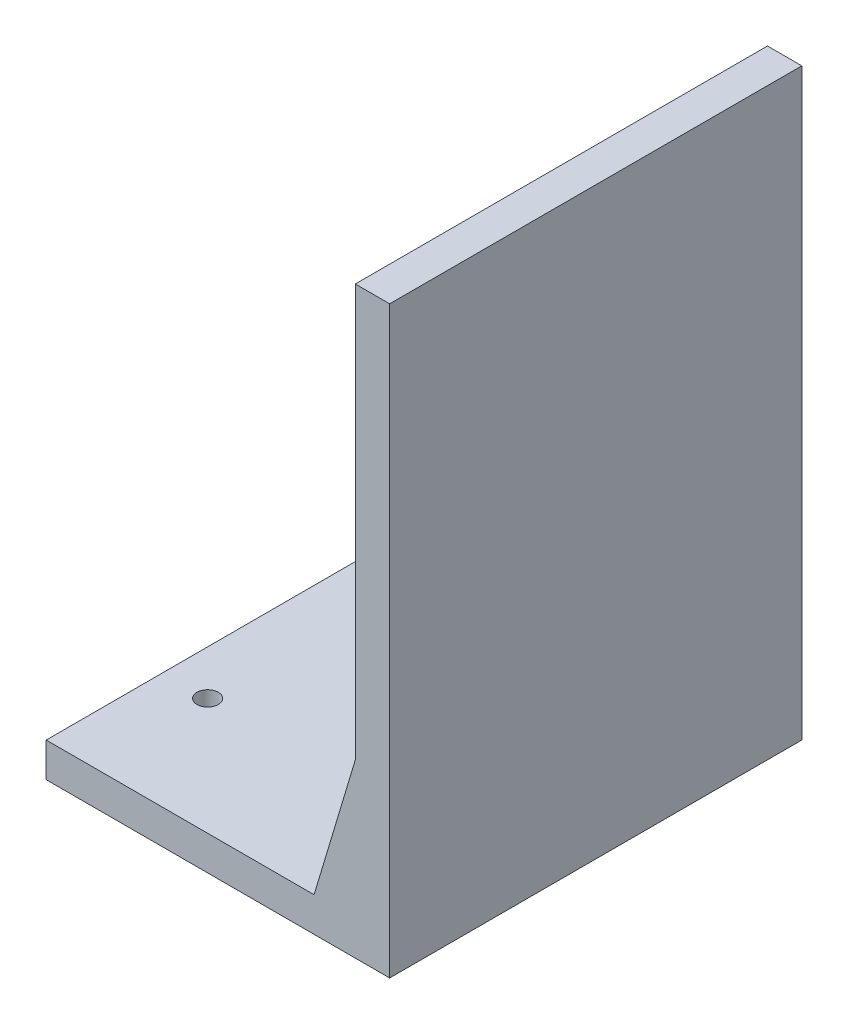
ISO-10303-21;
HEADER;
FILE_DESCRIPTION(('STEP AP214'),'2;1');
FILE_NAME('part.step','',(''),(''),'','','');
FILE_SCHEMA(('AUTOMOTIVE_DESIGN { 1 0 10303 214 1 1 1 1 }'));
ENDSEC;
DATA;
#1=APPLICATION_CONTEXT('core data for automotive mechanical design processes');
#2=APPLICATION_PROTOCOL_DEFINITION('international standard','automotive_design',2000,#1);
#3=PRODUCT_CONTEXT('',#1,'mechanical');
#4=PRODUCT('Part','Part','',(#3));
#5=PRODUCT_RELATED_PRODUCT_CATEGORY('part','',(#4));
#6=PRODUCT_DEFINITION_FORMATION('','',#4);
#7=PRODUCT_DEFINITION_CONTEXT('part definition',#1,'design');
#8=PRODUCT_DEFINITION('design','',#6,#7);
#9=PRODUCT_DEFINITION_SHAPE('','',#8);
#10=(LENGTH_UNIT() NAMED_UNIT(*) SI_UNIT(.MILLI.,.METRE.));
#11=(NAMED_UNIT(*) PLANE_ANGLE_UNIT() SI_UNIT($,.RADIAN.));
#12=(NAMED_UNIT(*) SI_UNIT($,.STERADIAN.) SOLID_ANGLE_UNIT());
#13=UNCERTAINTY_MEASURE_WITH_UNIT(LENGTH_MEASURE(1.E-05),#10,'distance_accuracy_value','');
#14=(GEOMETRIC_REPRESENTATION_CONTEXT(3) GLOBAL_UNCERTAINTY_ASSIGNED_CONTEXT((#13)) GLOBAL_UNIT_ASSIGNED_CONTEXT((#10,
#11,#12)) REPRESENTATION_CONTEXT('',''));
#15=CARTESIAN_POINT('',(0.,0.,0.));
#16=DIRECTION('',(0.,0.,1.));
#17=DIRECTION('',(1.,0.,0.));
#18=AXIS2_PLACEMENT_3D('',#15,#16,#17);
#19=CARTESIAN_POINT('',(0.,5.,0.));
#20=DIRECTION('',(0.,-1.,0.));
#21=DIRECTION('',(0.,0.,-1.));
#22=AXIS2_PLACEMENT_3D('',#19,#20,#21);
#23=PLANE('',#22);
#24=CARTESIAN_POINT('',(32.5,5.,-43.));
#25=DIRECTION('',(0.,1.,0.));
#26=DIRECTION('',(0.,0.,-1.));
#27=AXIS2_PLACEMENT_3D('',#24,#25,#26);
#28=CIRCLE('',#27,1.55);
#29=CARTESIAN_POINT('',(32.5,5.,-44.55));
#30=VERTEX_POINT('',#29);
#31=EDGE_CURVE('E330',#30,#30,#28,.T.);
#32=ORIENTED_EDGE('',*,*,#31,.F.);
#33=EDGE_LOOP('',(#32));
#34=FACE_BOUND('',#33,.T.);
#35=CARTESIAN_POINT('',(6.5,5.,-17.));
#36=DIRECTION('',(0.,1.,0.));
#37=DIRECTION('',(0.,0.,-1.));
#38=AXIS2_PLACEMENT_3D('',#35,#36,#37);
#39=CIRCLE('',#38,1.55);
#40=CARTESIAN_POINT('',(6.5,5.,-18.55));
#41=VERTEX_POINT('',#40);
#42=EDGE_CURVE('E321',#41,#41,#39,.T.);
#43=ORIENTED_EDGE('',*,*,#42,.F.);
#44=EDGE_LOOP('',(#43));
#45=FACE_BOUND('',#44,.T.);
#46=CARTESIAN_POINT('',(32.5,5.,-17.));
#47=DIRECTION('',(0.,1.,0.));
#48=DIRECTION('',(0.,0.,1.));
#49=AXIS2_PLACEMENT_3D('',#46,#47,#48);
#50=CIRCLE('',#49,1.55);
#51=CARTESIAN_POINT('',(32.5,5.,-15.45));
#52=VERTEX_POINT('',#51);
#53=EDGE_CURVE('E337',#52,#52,#50,.T.);
#54=ORIENTED_EDGE('',*,*,#53,.F.);
#55=EDGE_LOOP('',(#54));
#56=FACE_BOUND('',#55,.T.);
#57=CARTESIAN_POINT('',(6.5,5.,-43.));
#58=DIRECTION('',(0.,1.,0.));
#59=DIRECTION('',(0.,0.,1.));
#60=AXIS2_PLACEMENT_3D('',#57,#58,#59);
#61=CIRCLE('',#60,1.55);
#62=CARTESIAN_POINT('',(6.5,5.,-41.45));
#63=VERTEX_POINT('',#62);
#64=EDGE_CURVE('E313',#63,#63,#61,.T.);
#65=ORIENTED_EDGE('',*,*,#64,.F.);
#66=EDGE_LOOP('',(#65));
#67=FACE_BOUND('',#66,.T.);
#68=DIRECTION('',(-1.,0.,0.));
#69=VECTOR('',#68,1.);
#70=CARTESIAN_POINT('',(45.,5.,-35.));
#71=LINE('',#70,#69);
#72=CARTESIAN_POINT('',(45.,5.,-35.));
#73=VERTEX_POINT('',#72);
#74=CARTESIAN_POINT('',(39.,5.,-35.));
#75=VERTEX_POINT('',#74);
#76=EDGE_CURVE('E148',#73,#75,#71,.T.);
#77=ORIENTED_EDGE('',*,*,#76,.F.);
#78=DIRECTION('',(0.,0.,1.));
#79=VECTOR('',#78,1.);
#80=CARTESIAN_POINT('',(45.,5.,0.));
#81=LINE('',#80,#79);
#82=CARTESIAN_POINT('',(45.,5.,-50.));
#83=VERTEX_POINT('',#82);
#84=EDGE_CURVE('E212',#83,#73,#81,.T.);
#85=ORIENTED_EDGE('',*,*,#84,.F.);
#86=DIRECTION('',(-1.,0.,0.));
#87=VECTOR('',#86,1.);
#88=CARTESIAN_POINT('',(45.,5.,-50.));
#89=LINE('',#88,#87);
#90=CARTESIAN_POINT('',(39.,5.,-50.));
#91=VERTEX_POINT('',#90);
#92=EDGE_CURVE('E63',#83,#91,#89,.T.);
#93=ORIENTED_EDGE('',*,*,#92,.T.);
#94=DIRECTION('',(0.,0.,-1.));
#95=VECTOR('',#94,1.);
#96=CARTESIAN_POINT('',(39.,5.,-50.));
#97=LINE('',#96,#95);
#98=CARTESIAN_POINT('',(39.,5.,-60.));
#99=VERTEX_POINT('',#98);
#100=EDGE_CURVE('E175',#91,#99,#97,.T.);
#101=ORIENTED_EDGE('',*,*,#100,.T.);
#102=DIRECTION('',(-1.,0.,0.));
#103=VECTOR('',#102,1.);
#104=CARTESIAN_POINT('',(0.,5.,-60.));
#105=LINE('',#104,#103);
#106=CARTESIAN_POINT('',(0.,5.,-60.));
#107=VERTEX_POINT('',#106);
#108=EDGE_CURVE('E241',#99,#107,#105,.T.);
#109=ORIENTED_EDGE('',*,*,#108,.T.);
#110=DIRECTION('',(0.,0.,1.));
#111=VECTOR('',#110,1.);
#112=CARTESIAN_POINT('',(0.,5.,0.));
#113=LINE('',#112,#111);
#114=CARTESIAN_POINT('',(0.,5.,0.));
#115=VERTEX_POINT('',#114);
#116=EDGE_CURVE('E232',#107,#115,#113,.T.);
#117=ORIENTED_EDGE('',*,*,#116,.T.);
#118=DIRECTION('',(1.,0.,0.));
#119=VECTOR('',#118,1.);
#120=CARTESIAN_POINT('',(0.,5.,0.));
#121=LINE('',#120,#119);
#122=CARTESIAN_POINT('',(39.,5.,0.));
#123=VERTEX_POINT('',#122);
#124=EDGE_CURVE('E236',#115,#123,#121,.T.);
#125=ORIENTED_EDGE('',*,*,#124,.T.);
#126=DIRECTION('',(0.,0.,1.));
#127=VECTOR('',#126,1.);
#128=CARTESIAN_POINT('',(39.,5.,-10.));
#129=LINE('',#128,#127);
#130=CARTESIAN_POINT('',(39.,5.,-10.));
#131=VERTEX_POINT('',#130);
#132=EDGE_CURVE('E200',#131,#123,#129,.T.);
#133=ORIENTED_EDGE('',*,*,#132,.F.);
#134=DIRECTION('',(1.,0.,0.));
#135=VECTOR('',#134,1.);
#136=CARTESIAN_POINT('',(45.,5.,-10.));
#137=LINE('',#136,#135);
#138=CARTESIAN_POINT('',(45.,5.,-10.));
#139=VERTEX_POINT('',#138);
#140=EDGE_CURVE('E184',#131,#139,#137,.T.);
#141=ORIENTED_EDGE('',*,*,#140,.T.);
#142=CARTESIAN_POINT('',(45.,5.,-25.));
#143=VERTEX_POINT('',#142);
#144=EDGE_CURVE('E203',#143,#139,#81,.T.);
#145=ORIENTED_EDGE('',*,*,#144,.F.);
#146=DIRECTION('',(-1.,0.,0.));
#147=VECTOR('',#146,1.);
#148=CARTESIAN_POINT('',(45.,5.,-25.));
#149=LINE('',#148,#147);
#150=CARTESIAN_POINT('',(39.,5.,-25.));
#151=VERTEX_POINT('',#150);
#152=EDGE_CURVE('E55',#143,#151,#149,.T.);
#153=ORIENTED_EDGE('',*,*,#152,.T.);
#154=DIRECTION('',(0.,0.,1.));
#155=VECTOR('',#154,1.);
#156=CARTESIAN_POINT('',(39.,5.,-35.));
#157=LINE('',#156,#155);
#158=EDGE_CURVE('E141',#75,#151,#157,.T.);
#159=ORIENTED_EDGE('',*,*,#158,.F.);
#160=EDGE_LOOP('',(#77,#85,#93,#101,#109,#117,#125,#133,#141,#145,#153,#159));
#161=FACE_BOUND('',#160,.T.);
#162=ADVANCED_FACE('F39',(#34,#45,#56,#67,#161),#23,.F.);
#163=CARTESIAN_POINT('',(45.,85.,0.));
#164=DIRECTION('',(1.,0.,0.));
#165=DIRECTION('',(0.,0.,-1.));
#166=AXIS2_PLACEMENT_3D('',#163,#164,#165);
#167=PLANE('',#166);
#168=DIRECTION('',(0.,-1.,0.));
#169=VECTOR('',#168,1.);
#170=CARTESIAN_POINT('',(45.,25.,-35.));
#171=LINE('',#170,#169);
#172=CARTESIAN_POINT('',(45.,25.,-35.));
#173=VERTEX_POINT('',#172);
#174=EDGE_CURVE('E147',#173,#73,#171,.T.);
#175=ORIENTED_EDGE('',*,*,#174,.F.);
#176=DIRECTION('',(0.,0.,1.));
#177=VECTOR('',#176,1.);
#178=CARTESIAN_POINT('',(45.,25.,-35.));
#179=LINE('',#178,#177);
#180=CARTESIAN_POINT('',(45.,25.,-25.));
#181=VERTEX_POINT('',#180);
#182=EDGE_CURVE('E143',#173,#181,#179,.T.);
#183=ORIENTED_EDGE('',*,*,#182,.T.);
#184=DIRECTION('',(0.,-1.,0.));
#185=VECTOR('',#184,1.);
#186=CARTESIAN_POINT('',(45.,25.,-25.));
#187=LINE('',#186,#185);
#188=EDGE_CURVE('E154',#181,#143,#187,.T.);
#189=ORIENTED_EDGE('',*,*,#188,.T.);
#190=ORIENTED_EDGE('',*,*,#144,.T.);
#191=DIRECTION('',(0.,1.,0.));
#192=VECTOR('',#191,1.);
#193=CARTESIAN_POINT('',(45.,25.,-10.));
#194=LINE('',#193,#192);
#195=CARTESIAN_POINT('',(45.,25.,-10.));
#196=VERTEX_POINT('',#195);
#197=EDGE_CURVE('E188',#139,#196,#194,.T.);
#198=ORIENTED_EDGE('',*,*,#197,.T.);
#199=DIRECTION('',(0.,0.,1.));
#200=VECTOR('',#199,1.);
#201=CARTESIAN_POINT('',(45.,25.,-10.));
#202=LINE('',#201,#200);
#203=CARTESIAN_POINT('',(45.,25.,0.));
#204=VERTEX_POINT('',#203);
#205=EDGE_CURVE('E196',#196,#204,#202,.T.);
#206=ORIENTED_EDGE('',*,*,#205,.T.);
#207=DIRECTION('',(0.,-1.,0.));
#208=VECTOR('',#207,1.);
#209=CARTESIAN_POINT('',(45.,85.,0.));
#210=LINE('',#209,#208);
#211=CARTESIAN_POINT('',(45.,85.,0.));
#212=VERTEX_POINT('',#211);
#213=EDGE_CURVE('E222',#212,#204,#210,.T.);
#214=ORIENTED_EDGE('',*,*,#213,.F.);
#215=DIRECTION('',(0.,0.,1.));
#216=VECTOR('',#215,1.);
#217=CARTESIAN_POINT('',(45.,85.,0.));
#218=LINE('',#217,#216);
#219=CARTESIAN_POINT('',(45.,85.,-60.));
#220=VERTEX_POINT('',#219);
#221=EDGE_CURVE('E215',#220,#212,#218,.T.);
#222=ORIENTED_EDGE('',*,*,#221,.F.);
#223=DIRECTION('',(0.,-1.,0.));
#224=VECTOR('',#223,1.);
#225=CARTESIAN_POINT('',(45.,85.,-60.));
#226=LINE('',#225,#224);
#227=CARTESIAN_POINT('',(45.,25.,-60.));
#228=VERTEX_POINT('',#227);
#229=EDGE_CURVE('E228',#220,#228,#226,.T.);
#230=ORIENTED_EDGE('',*,*,#229,.T.);
#231=DIRECTION('',(0.,0.,-1.));
#232=VECTOR('',#231,1.);
#233=CARTESIAN_POINT('',(45.,25.,-50.));
#234=LINE('',#233,#232);
#235=CARTESIAN_POINT('',(45.,25.,-50.));
#236=VERTEX_POINT('',#235);
#237=EDGE_CURVE('E177',#236,#228,#234,.T.);
#238=ORIENTED_EDGE('',*,*,#237,.F.);
#239=DIRECTION('',(0.,-1.,0.));
#240=VECTOR('',#239,1.);
#241=CARTESIAN_POINT('',(45.,25.,-50.));
#242=LINE('',#241,#240);
#243=EDGE_CURVE('E173',#236,#83,#242,.T.);
#244=ORIENTED_EDGE('',*,*,#243,.T.);
#245=ORIENTED_EDGE('',*,*,#84,.T.);
#246=EDGE_LOOP('',(#175,#183,#189,#190,#198,#206,#214,#222,#230,#238,#244,#245));
#247=FACE_BOUND('',#246,.T.);
#248=ADVANCED_FACE('F290',(#247),#167,.F.);
#249=CARTESIAN_POINT('',(0.,5.,0.));
#250=DIRECTION('',(1.,0.,0.));
#251=DIRECTION('',(0.,0.,-1.));
#252=AXIS2_PLACEMENT_3D('',#249,#250,#251);
#253=PLANE('',#252);
#254=DIRECTION('',(0.,0.,1.));
#255=VECTOR('',#254,1.);
#256=CARTESIAN_POINT('',(0.,0.,0.));
#257=LINE('',#256,#255);
#258=CARTESIAN_POINT('',(0.,0.,-60.));
#259=VERTEX_POINT('',#258);
#260=CARTESIAN_POINT('',(0.,0.,0.));
#261=VERTEX_POINT('',#260);
#262=EDGE_CURVE('E231',#259,#261,#257,.T.);
#263=ORIENTED_EDGE('',*,*,#262,.T.);
#264=DIRECTION('',(0.,-1.,0.));
#265=VECTOR('',#264,1.);
#266=CARTESIAN_POINT('',(0.,5.,0.));
#267=LINE('',#266,#265);
#268=EDGE_CURVE('E11',#115,#261,#267,.T.);
#269=ORIENTED_EDGE('',*,*,#268,.F.);
#270=ORIENTED_EDGE('',*,*,#116,.F.);
#271=DIRECTION('',(0.,-1.,0.));
#272=VECTOR('',#271,1.);
#273=CARTESIAN_POINT('',(0.,5.,-60.));
#274=LINE('',#273,#272);
#275=EDGE_CURVE('E244',#107,#259,#274,.T.);
#276=ORIENTED_EDGE('',*,*,#275,.T.);
#277=EDGE_LOOP('',(#263,#269,#270,#276));
#278=FACE_BOUND('',#277,.T.);
#279=ADVANCED_FACE('F41',(#278),#253,.F.);
#280=CARTESIAN_POINT('',(0.,5.,0.));
#281=DIRECTION('',(0.,0.,-1.));
#282=DIRECTION('',(-1.,0.,0.));
#283=AXIS2_PLACEMENT_3D('',#280,#281,#282);
#284=PLANE('',#283);
#285=DIRECTION('',(1.,0.,0.));
#286=VECTOR('',#285,1.);
#287=CARTESIAN_POINT('',(0.,0.,0.));
#288=LINE('',#287,#286);
#289=CARTESIAN_POINT('',(50.,0.,0.));
#290=VERTEX_POINT('',#289);
#291=EDGE_CURVE('E248',#261,#290,#288,.T.);
#292=ORIENTED_EDGE('',*,*,#291,.T.);
#293=DIRECTION('',(0.,-1.,0.));
#294=VECTOR('',#293,1.);
#295=CARTESIAN_POINT('',(50.,5.,0.));
#296=LINE('',#295,#294);
#297=CARTESIAN_POINT('',(50.,85.,0.));
#298=VERTEX_POINT('',#297);
#299=EDGE_CURVE('E48',#298,#290,#296,.T.);
#300=ORIENTED_EDGE('',*,*,#299,.F.);
#301=DIRECTION('',(1.,0.,0.));
#302=VECTOR('',#301,1.);
#303=CARTESIAN_POINT('',(50.,85.,0.));
#304=LINE('',#303,#302);
#305=EDGE_CURVE('E218',#212,#298,#304,.T.);
#306=ORIENTED_EDGE('',*,*,#305,.F.);
#307=ORIENTED_EDGE('',*,*,#213,.T.);
#308=DIRECTION('',(-0.287347885566345,-0.957826285221151,0.));
#309=VECTOR('',#308,1.);
#310=CARTESIAN_POINT('',(39.,5.,0.));
#311=LINE('',#310,#309);
#312=EDGE_CURVE('E181',#204,#123,#311,.T.);
#313=ORIENTED_EDGE('',*,*,#312,.T.);
#314=ORIENTED_EDGE('',*,*,#124,.F.);
#315=ORIENTED_EDGE('',*,*,#268,.T.);
#316=EDGE_LOOP('',(#292,#300,#306,#307,#313,#314,#315));
#317=FACE_BOUND('',#316,.T.);
#318=ADVANCED_FACE('F295',(#317),#284,.F.);
#319=CARTESIAN_POINT('',(50.,5.,0.));
#320=DIRECTION('',(-1.,0.,0.));
#321=DIRECTION('',(0.,0.,1.));
#322=AXIS2_PLACEMENT_3D('',#319,#320,#321);
#323=PLANE('',#322);
#324=DIRECTION('',(0.,0.,-1.));
#325=VECTOR('',#324,1.);
#326=CARTESIAN_POINT('',(50.,0.,0.));
#327=LINE('',#326,#325);
#328=CARTESIAN_POINT('',(50.,0.,-60.));
#329=VERTEX_POINT('',#328);
#330=EDGE_CURVE('E251',#290,#329,#327,.T.);
#331=ORIENTED_EDGE('',*,*,#330,.T.);
#332=DIRECTION('',(0.,-1.,0.));
#333=VECTOR('',#332,1.);
#334=CARTESIAN_POINT('',(50.,5.,-60.));
#335=LINE('',#334,#333);
#336=CARTESIAN_POINT('',(50.,85.,-60.));
#337=VERTEX_POINT('',#336);
#338=EDGE_CURVE('E259',#337,#329,#335,.T.);
#339=ORIENTED_EDGE('',*,*,#338,.F.);
#340=DIRECTION('',(0.,0.,-1.));
#341=VECTOR('',#340,1.);
#342=CARTESIAN_POINT('',(50.,85.,0.));
#343=LINE('',#342,#341);
#344=EDGE_CURVE('E207',#298,#337,#343,.T.);
#345=ORIENTED_EDGE('',*,*,#344,.F.);
#346=ORIENTED_EDGE('',*,*,#299,.T.);
#347=EDGE_LOOP('',(#331,#339,#345,#346));
#348=FACE_BOUND('',#347,.T.);
#349=ADVANCED_FACE('F267',(#348),#323,.F.);
#350=CARTESIAN_POINT('',(0.,5.,-60.));
#351=DIRECTION('',(0.,0.,1.));
#352=DIRECTION('',(1.,0.,0.));
#353=AXIS2_PLACEMENT_3D('',#350,#351,#352);
#354=PLANE('',#353);
#355=ORIENTED_EDGE('',*,*,#108,.F.);
#356=DIRECTION('',(0.287347885566345,0.957826285221151,0.));
#357=VECTOR('',#356,1.);
#358=CARTESIAN_POINT('',(39.,5.,-60.));
#359=LINE('',#358,#357);
#360=EDGE_CURVE('E158',#99,#228,#359,.T.);
#361=ORIENTED_EDGE('',*,*,#360,.T.);
#362=ORIENTED_EDGE('',*,*,#229,.F.);
#363=DIRECTION('',(-1.,0.,0.));
#364=VECTOR('',#363,1.);
#365=CARTESIAN_POINT('',(50.,85.,-60.));
#366=LINE('',#365,#364);
#367=EDGE_CURVE('E211',#337,#220,#366,.T.);
#368=ORIENTED_EDGE('',*,*,#367,.F.);
#369=ORIENTED_EDGE('',*,*,#338,.T.);
#370=DIRECTION('',(-1.,0.,0.));
#371=VECTOR('',#370,1.);
#372=CARTESIAN_POINT('',(0.,0.,-60.));
#373=LINE('',#372,#371);
#374=EDGE_CURVE('E237',#329,#259,#373,.T.);
#375=ORIENTED_EDGE('',*,*,#374,.T.);
#376=ORIENTED_EDGE('',*,*,#275,.F.);
#377=EDGE_LOOP('',(#355,#361,#362,#368,#369,#375,#376));
#378=FACE_BOUND('',#377,.T.);
#379=ADVANCED_FACE('F277',(#378),#354,.F.);
#380=CARTESIAN_POINT('',(0.,0.,0.));
#381=DIRECTION('',(0.,-1.,0.));
#382=DIRECTION('',(0.,0.,-1.));
#383=AXIS2_PLACEMENT_3D('',#380,#381,#382);
#384=PLANE('',#383);
#385=CARTESIAN_POINT('',(32.5,0.,-43.));
#386=DIRECTION('',(0.,1.,0.));
#387=DIRECTION('',(0.,0.,-1.));
#388=AXIS2_PLACEMENT_3D('',#385,#386,#387);
#389=CIRCLE('',#388,1.55);
#390=CARTESIAN_POINT('',(32.5,0.,-44.55));
#391=VERTEX_POINT('',#390);
#392=EDGE_CURVE('E317',#391,#391,#389,.T.);
#393=ORIENTED_EDGE('',*,*,#392,.T.);
#394=EDGE_LOOP('',(#393));
#395=FACE_BOUND('',#394,.T.);
#396=CARTESIAN_POINT('',(6.5,0.,-17.));
#397=DIRECTION('',(0.,1.,0.));
#398=DIRECTION('',(0.,0.,-1.));
#399=AXIS2_PLACEMENT_3D('',#396,#397,#398);
#400=CIRCLE('',#399,1.55);
#401=CARTESIAN_POINT('',(6.5,0.,-18.55));
#402=VERTEX_POINT('',#401);
#403=EDGE_CURVE('E325',#402,#402,#400,.T.);
#404=ORIENTED_EDGE('',*,*,#403,.T.);
#405=EDGE_LOOP('',(#404));
#406=FACE_BOUND('',#405,.T.);
#407=CARTESIAN_POINT('',(32.5,0.,-17.));
#408=DIRECTION('',(0.,1.,0.));
#409=DIRECTION('',(0.,0.,1.));
#410=AXIS2_PLACEMENT_3D('',#407,#408,#409);
#411=CIRCLE('',#410,1.55);
#412=CARTESIAN_POINT('',(32.5,0.,-15.45));
#413=VERTEX_POINT('',#412);
#414=EDGE_CURVE('E326',#413,#413,#411,.T.);
#415=ORIENTED_EDGE('',*,*,#414,.T.);
#416=EDGE_LOOP('',(#415));
#417=FACE_BOUND('',#416,.T.);
#418=CARTESIAN_POINT('',(6.5,0.,-43.));
#419=DIRECTION('',(0.,1.,0.));
#420=DIRECTION('',(0.,0.,1.));
#421=AXIS2_PLACEMENT_3D('',#418,#419,#420);
#422=CIRCLE('',#421,1.55);
#423=CARTESIAN_POINT('',(6.5,0.,-41.45));
#424=VERTEX_POINT('',#423);
#425=EDGE_CURVE('E310',#424,#424,#422,.T.);
#426=ORIENTED_EDGE('',*,*,#425,.T.);
#427=EDGE_LOOP('',(#426));
#428=FACE_BOUND('',#427,.T.);
#429=ORIENTED_EDGE('',*,*,#262,.F.);
#430=ORIENTED_EDGE('',*,*,#374,.F.);
#431=ORIENTED_EDGE('',*,*,#330,.F.);
#432=ORIENTED_EDGE('',*,*,#291,.F.);
#433=EDGE_LOOP('',(#429,#430,#431,#432));
#434=FACE_BOUND('',#433,.T.);
#435=ADVANCED_FACE('F273',(#395,#406,#417,#428,#434),#384,.T.);
#436=CARTESIAN_POINT('',(0.,85.,0.));
#437=DIRECTION('',(0.,1.,0.));
#438=DIRECTION('',(0.,0.,1.));
#439=AXIS2_PLACEMENT_3D('',#436,#437,#438);
#440=PLANE('',#439);
#441=ORIENTED_EDGE('',*,*,#344,.T.);
#442=ORIENTED_EDGE('',*,*,#367,.T.);
#443=ORIENTED_EDGE('',*,*,#221,.T.);
#444=ORIENTED_EDGE('',*,*,#305,.T.);
#445=EDGE_LOOP('',(#441,#442,#443,#444));
#446=FACE_BOUND('',#445,.T.);
#447=ADVANCED_FACE('F294',(#446),#440,.T.);
#448=CARTESIAN_POINT('',(39.,5.,-10.));
#449=DIRECTION('',(-0.957826285221151,0.287347885566345,0.));
#450=DIRECTION('',(-0.287347885566345,-0.957826285221151,0.));
#451=AXIS2_PLACEMENT_3D('',#448,#449,#450);
#452=PLANE('',#451);
#453=ORIENTED_EDGE('',*,*,#312,.F.);
#454=ORIENTED_EDGE('',*,*,#205,.F.);
#455=DIRECTION('',(-0.287347885566345,-0.957826285221151,0.));
#456=VECTOR('',#455,1.);
#457=CARTESIAN_POINT('',(39.,5.,-10.));
#458=LINE('',#457,#456);
#459=EDGE_CURVE('E192',#196,#131,#458,.T.);
#460=ORIENTED_EDGE('',*,*,#459,.T.);
#461=ORIENTED_EDGE('',*,*,#132,.T.);
#462=EDGE_LOOP('',(#453,#454,#460,#461));
#463=FACE_BOUND('',#462,.T.);
#464=ADVANCED_FACE('F299',(#463),#452,.T.);
#465=CARTESIAN_POINT('',(0.,0.,-10.));
#466=DIRECTION('',(0.,0.,1.));
#467=DIRECTION('',(1.,0.,0.));
#468=AXIS2_PLACEMENT_3D('',#465,#466,#467);
#469=PLANE('',#468);
#470=ORIENTED_EDGE('',*,*,#140,.F.);
#471=ORIENTED_EDGE('',*,*,#459,.F.);
#472=ORIENTED_EDGE('',*,*,#197,.F.);
#473=EDGE_LOOP('',(#470,#471,#472));
#474=FACE_BOUND('',#473,.T.);
#475=ADVANCED_FACE('F301',(#474),#469,.F.);
#476=CARTESIAN_POINT('',(39.,5.,-50.));
#477=DIRECTION('',(-0.957826285221151,0.287347885566345,0.));
#478=DIRECTION('',(-0.287347885566345,-0.957826285221151,0.));
#479=AXIS2_PLACEMENT_3D('',#476,#477,#478);
#480=PLANE('',#479);
#481=ORIENTED_EDGE('',*,*,#360,.F.);
#482=ORIENTED_EDGE('',*,*,#100,.F.);
#483=DIRECTION('',(0.287347885566345,0.957826285221151,0.));
#484=VECTOR('',#483,1.);
#485=CARTESIAN_POINT('',(39.,5.,-50.));
#486=LINE('',#485,#484);
#487=EDGE_CURVE('E169',#91,#236,#486,.T.);
#488=ORIENTED_EDGE('',*,*,#487,.T.);
#489=ORIENTED_EDGE('',*,*,#237,.T.);
#490=EDGE_LOOP('',(#481,#482,#488,#489));
#491=FACE_BOUND('',#490,.T.);
#492=ADVANCED_FACE('F286',(#491),#480,.T.);
#493=CARTESIAN_POINT('',(0.,0.,-50.));
#494=DIRECTION('',(0.,0.,1.));
#495=DIRECTION('',(1.,0.,0.));
#496=AXIS2_PLACEMENT_3D('',#493,#494,#495);
#497=PLANE('',#496);
#498=ORIENTED_EDGE('',*,*,#92,.F.);
#499=ORIENTED_EDGE('',*,*,#243,.F.);
#500=ORIENTED_EDGE('',*,*,#487,.F.);
#501=EDGE_LOOP('',(#498,#499,#500));
#502=FACE_BOUND('',#501,.T.);
#503=ADVANCED_FACE('F377',(#502),#497,.T.);
#504=CARTESIAN_POINT('',(39.,5.,-35.));
#505=DIRECTION('',(0.957826285221151,-0.287347885566345,0.));
#506=DIRECTION('',(0.287347885566345,0.957826285221151,0.));
#507=AXIS2_PLACEMENT_3D('',#504,#505,#506);
#508=PLANE('',#507);
#509=DIRECTION('',(0.287347885566345,0.957826285221151,0.));
#510=VECTOR('',#509,1.);
#511=CARTESIAN_POINT('',(39.,5.,-25.));
#512=LINE('',#511,#510);
#513=EDGE_CURVE('E304',#151,#181,#512,.T.);
#514=ORIENTED_EDGE('',*,*,#513,.T.);
#515=ORIENTED_EDGE('',*,*,#182,.F.);
#516=DIRECTION('',(0.287347885566345,0.957826285221151,0.));
#517=VECTOR('',#516,1.);
#518=CARTESIAN_POINT('',(39.,5.,-35.));
#519=LINE('',#518,#517);
#520=EDGE_CURVE('E137',#75,#173,#519,.T.);
#521=ORIENTED_EDGE('',*,*,#520,.F.);
#522=ORIENTED_EDGE('',*,*,#158,.T.);
#523=EDGE_LOOP('',(#514,#515,#521,#522));
#524=FACE_BOUND('',#523,.T.);
#525=ADVANCED_FACE('F139',(#524),#508,.F.);
#526=CARTESIAN_POINT('',(0.,0.,-35.));
#527=DIRECTION('',(0.,0.,1.));
#528=DIRECTION('',(1.,0.,0.));
#529=AXIS2_PLACEMENT_3D('',#526,#527,#528);
#530=PLANE('',#529);
#531=ORIENTED_EDGE('',*,*,#76,.T.);
#532=ORIENTED_EDGE('',*,*,#520,.T.);
#533=ORIENTED_EDGE('',*,*,#174,.T.);
#534=EDGE_LOOP('',(#531,#532,#533));
#535=FACE_BOUND('',#534,.T.);
#536=ADVANCED_FACE('F151',(#535),#530,.F.);
#537=CARTESIAN_POINT('',(0.,0.,-25.));
#538=DIRECTION('',(0.,0.,1.));
#539=DIRECTION('',(1.,0.,0.));
#540=AXIS2_PLACEMENT_3D('',#537,#538,#539);
#541=PLANE('',#540);
#542=ORIENTED_EDGE('',*,*,#152,.F.);
#543=ORIENTED_EDGE('',*,*,#188,.F.);
#544=ORIENTED_EDGE('',*,*,#513,.F.);
#545=EDGE_LOOP('',(#542,#543,#544));
#546=FACE_BOUND('',#545,.T.);
#547=ADVANCED_FACE('F362',(#546),#541,.T.);
#548=CARTESIAN_POINT('',(6.5,0.,-43.));
#549=DIRECTION('',(0.,1.,0.));
#550=DIRECTION('',(0.,0.,1.));
#551=AXIS2_PLACEMENT_3D('',#548,#549,#550);
#552=CYLINDRICAL_SURFACE('',#551,1.55);
#553=ORIENTED_EDGE('',*,*,#425,.F.);
#554=EDGE_LOOP('',(#553));
#555=FACE_BOUND('',#554,.T.);
#556=ORIENTED_EDGE('',*,*,#64,.T.);
#557=EDGE_LOOP('',(#556));
#558=FACE_BOUND('',#557,.T.);
#559=ADVANCED_FACE('F351',(#555,#558),#552,.F.);
#560=CARTESIAN_POINT('',(32.5,0.,-17.));
#561=DIRECTION('',(0.,1.,0.));
#562=DIRECTION('',(0.,0.,1.));
#563=AXIS2_PLACEMENT_3D('',#560,#561,#562);
#564=CYLINDRICAL_SURFACE('',#563,1.55);
#565=ORIENTED_EDGE('',*,*,#414,.F.);
#566=EDGE_LOOP('',(#565));
#567=FACE_BOUND('',#566,.T.);
#568=ORIENTED_EDGE('',*,*,#53,.T.);
#569=EDGE_LOOP('',(#568));
#570=FACE_BOUND('',#569,.T.);
#571=ADVANCED_FACE('F347',(#567,#570),#564,.F.);
#572=CARTESIAN_POINT('',(6.5,0.,-17.));
#573=DIRECTION('',(0.,1.,0.));
#574=DIRECTION('',(0.,0.,1.));
#575=AXIS2_PLACEMENT_3D('',#572,#573,#574);
#576=CYLINDRICAL_SURFACE('',#575,1.55);
#577=ORIENTED_EDGE('',*,*,#403,.F.);
#578=EDGE_LOOP('',(#577));
#579=FACE_BOUND('',#578,.T.);
#580=ORIENTED_EDGE('',*,*,#42,.T.);
#581=EDGE_LOOP('',(#580));
#582=FACE_BOUND('',#581,.T.);
#583=ADVANCED_FACE('F350',(#579,#582),#576,.F.);
#584=CARTESIAN_POINT('',(32.5,0.,-43.));
#585=DIRECTION('',(0.,1.,0.));
#586=DIRECTION('',(0.,0.,1.));
#587=AXIS2_PLACEMENT_3D('',#584,#585,#586);
#588=CYLINDRICAL_SURFACE('',#587,1.55);
#589=ORIENTED_EDGE('',*,*,#392,.F.);
#590=EDGE_LOOP('',(#589));
#591=FACE_BOUND('',#590,.T.);
#592=ORIENTED_EDGE('',*,*,#31,.T.);
#593=EDGE_LOOP('',(#592));
#594=FACE_BOUND('',#593,.T.);
#595=ADVANCED_FACE('F446',(#591,#594),#588,.F.);
#596=CLOSED_SHELL('',(#162,#248,#279,#318,#349,#379,#435,#447,#464,#475,#492,#503,#525,#536,
#547,#559,#571,#583,#595));
#597=MANIFOLD_SOLID_BREP('B2',#596);
#598=ADVANCED_BREP_SHAPE_REPRESENTATION('',(#18,#597),#14);
#599=SHAPE_DEFINITION_REPRESENTATION(#9,#598);
ENDSEC;
END-ISO-10303-21;
